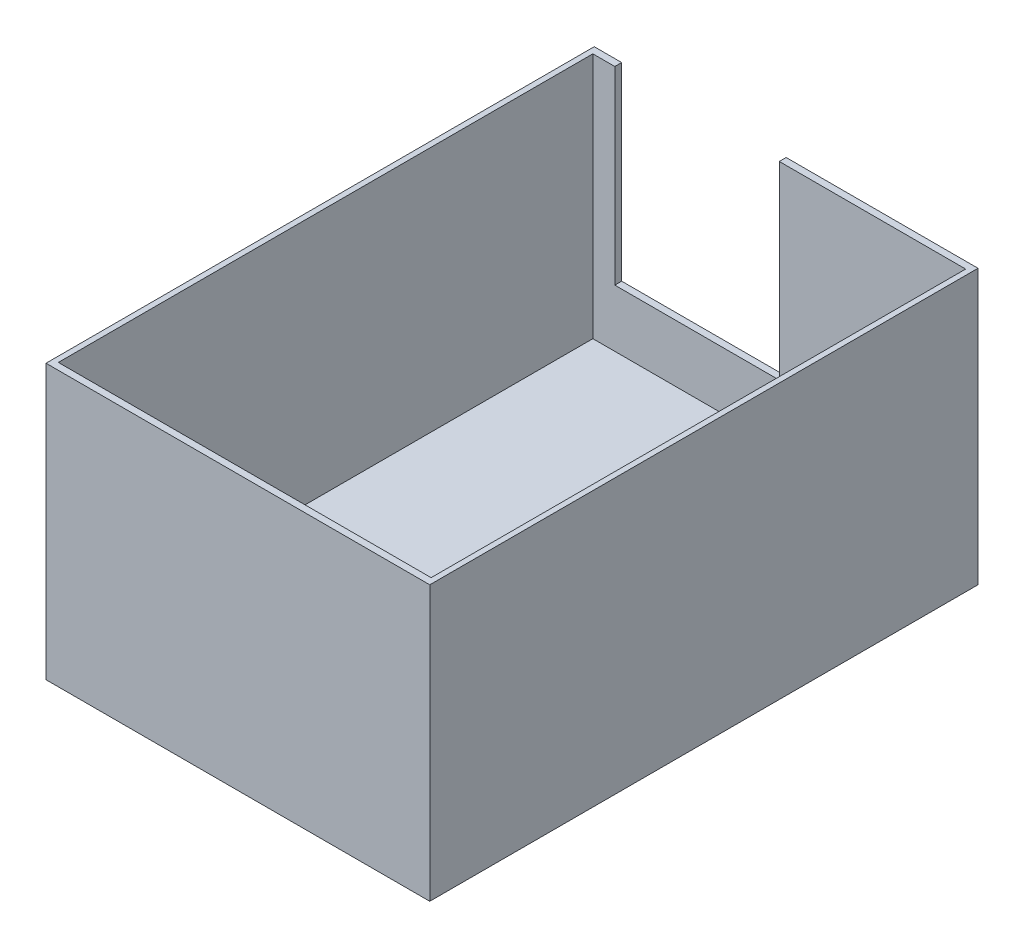
ISO-10303-21;
HEADER;
FILE_DESCRIPTION(('STEP AP214'),'2;1');
FILE_NAME('part.step','',(''),(''),'','','');
FILE_SCHEMA(('AUTOMOTIVE_DESIGN { 1 0 10303 214 1 1 1 1 }'));
ENDSEC;
DATA;
#1=APPLICATION_CONTEXT('core data for automotive mechanical design processes');
#2=APPLICATION_PROTOCOL_DEFINITION('international standard','automotive_design',2000,#1);
#3=PRODUCT_CONTEXT('',#1,'mechanical');
#4=PRODUCT('Part','Part','',(#3));
#5=PRODUCT_RELATED_PRODUCT_CATEGORY('part','',(#4));
#6=PRODUCT_DEFINITION_FORMATION('','',#4);
#7=PRODUCT_DEFINITION_CONTEXT('part definition',#1,'design');
#8=PRODUCT_DEFINITION('design','',#6,#7);
#9=PRODUCT_DEFINITION_SHAPE('','',#8);
#10=(LENGTH_UNIT() NAMED_UNIT(*) SI_UNIT(.MILLI.,.METRE.));
#11=(NAMED_UNIT(*) PLANE_ANGLE_UNIT() SI_UNIT($,.RADIAN.));
#12=(NAMED_UNIT(*) SI_UNIT($,.STERADIAN.) SOLID_ANGLE_UNIT());
#13=UNCERTAINTY_MEASURE_WITH_UNIT(LENGTH_MEASURE(1.E-05),#10,'distance_accuracy_value','');
#14=(GEOMETRIC_REPRESENTATION_CONTEXT(3) GLOBAL_UNCERTAINTY_ASSIGNED_CONTEXT((#13)) GLOBAL_UNIT_ASSIGNED_CONTEXT((#10,
#11,#12)) REPRESENTATION_CONTEXT('',''));
#15=CARTESIAN_POINT('',(0.,0.,0.));
#16=DIRECTION('',(0.,0.,1.));
#17=DIRECTION('',(1.,0.,0.));
#18=AXIS2_PLACEMENT_3D('',#15,#16,#17);
#19=CARTESIAN_POINT('',(35.,50.,-50.));
#20=DIRECTION('',(-1.,0.,0.));
#21=DIRECTION('',(0.,0.,1.));
#22=AXIS2_PLACEMENT_3D('',#19,#20,#21);
#23=PLANE('',#22);
#24=DIRECTION('',(0.,0.,-1.));
#25=VECTOR('',#24,1.);
#26=CARTESIAN_POINT('',(35.,0.,-50.));
#27=LINE('',#26,#25);
#28=CARTESIAN_POINT('',(35.,0.,50.));
#29=VERTEX_POINT('',#28);
#30=CARTESIAN_POINT('',(35.,0.,-50.));
#31=VERTEX_POINT('',#30);
#32=EDGE_CURVE('E196',#29,#31,#27,.T.);
#33=ORIENTED_EDGE('',*,*,#32,.T.);
#34=DIRECTION('',(0.,-1.,0.));
#35=VECTOR('',#34,1.);
#36=CARTESIAN_POINT('',(35.,50.,-50.));
#37=LINE('',#36,#35);
#38=CARTESIAN_POINT('',(35.,50.,-50.));
#39=VERTEX_POINT('',#38);
#40=EDGE_CURVE('E244',#39,#31,#37,.T.);
#41=ORIENTED_EDGE('',*,*,#40,.F.);
#42=DIRECTION('',(0.,0.,-1.));
#43=VECTOR('',#42,1.);
#44=CARTESIAN_POINT('',(35.,50.,-50.));
#45=LINE('',#44,#43);
#46=CARTESIAN_POINT('',(35.,50.,50.));
#47=VERTEX_POINT('',#46);
#48=EDGE_CURVE('E206',#47,#39,#45,.T.);
#49=ORIENTED_EDGE('',*,*,#48,.F.);
#50=DIRECTION('',(0.,-1.,0.));
#51=VECTOR('',#50,1.);
#52=CARTESIAN_POINT('',(35.,50.,50.));
#53=LINE('',#52,#51);
#54=EDGE_CURVE('E221',#47,#29,#53,.T.);
#55=ORIENTED_EDGE('',*,*,#54,.T.);
#56=EDGE_LOOP('',(#33,#41,#49,#55));
#57=FACE_BOUND('',#56,.T.);
#58=ADVANCED_FACE('F39',(#57),#23,.F.);
#59=CARTESIAN_POINT('',(-35.,50.,-50.));
#60=DIRECTION('',(0.,0.,1.));
#61=DIRECTION('',(1.,0.,0.));
#62=AXIS2_PLACEMENT_3D('',#59,#60,#61);
#63=PLANE('',#62);
#64=DIRECTION('',(-1.,0.,0.));
#65=VECTOR('',#64,1.);
#66=CARTESIAN_POINT('',(0.,15.4616107052777,-50.));
#67=LINE('',#66,#65);
#68=CARTESIAN_POINT('',(0.,15.4616107052777,-50.));
#69=VERTEX_POINT('',#68);
#70=CARTESIAN_POINT('',(-30.,15.4616107052777,-50.));
#71=VERTEX_POINT('',#70);
#72=EDGE_CURVE('E138',#69,#71,#67,.T.);
#73=ORIENTED_EDGE('',*,*,#72,.F.);
#74=DIRECTION('',(0.,-1.,0.));
#75=VECTOR('',#74,1.);
#76=CARTESIAN_POINT('',(0.,15.4616107052777,-50.));
#77=LINE('',#76,#75);
#78=CARTESIAN_POINT('',(0.,50.,-50.));
#79=VERTEX_POINT('',#78);
#80=EDGE_CURVE('E128',#79,#69,#77,.T.);
#81=ORIENTED_EDGE('',*,*,#80,.F.);
#82=DIRECTION('',(-1.,0.,0.));
#83=VECTOR('',#82,1.);
#84=CARTESIAN_POINT('',(-35.,50.,-50.));
#85=LINE('',#84,#83);
#86=EDGE_CURVE('E212',#39,#79,#85,.T.);
#87=ORIENTED_EDGE('',*,*,#86,.F.);
#88=ORIENTED_EDGE('',*,*,#40,.T.);
#89=DIRECTION('',(-1.,0.,0.));
#90=VECTOR('',#89,1.);
#91=CARTESIAN_POINT('',(-35.,0.,-50.));
#92=LINE('',#91,#90);
#93=CARTESIAN_POINT('',(-35.,0.,-50.));
#94=VERTEX_POINT('',#93);
#95=EDGE_CURVE('E225',#31,#94,#92,.T.);
#96=ORIENTED_EDGE('',*,*,#95,.T.);
#97=DIRECTION('',(0.,-1.,0.));
#98=VECTOR('',#97,1.);
#99=CARTESIAN_POINT('',(-35.,50.,-50.));
#100=LINE('',#99,#98);
#101=CARTESIAN_POINT('',(-35.,50.,-50.));
#102=VERTEX_POINT('',#101);
#103=EDGE_CURVE('E240',#102,#94,#100,.T.);
#104=ORIENTED_EDGE('',*,*,#103,.F.);
#105=CARTESIAN_POINT('',(-30.,50.,-50.));
#106=VERTEX_POINT('',#105);
#107=EDGE_CURVE('E210',#106,#102,#85,.T.);
#108=ORIENTED_EDGE('',*,*,#107,.F.);
#109=DIRECTION('',(0.,1.,0.));
#110=VECTOR('',#109,1.);
#111=CARTESIAN_POINT('',(-30.,15.4616107052777,-50.));
#112=LINE('',#111,#110);
#113=EDGE_CURVE('E145',#71,#106,#112,.T.);
#114=ORIENTED_EDGE('',*,*,#113,.F.);
#115=EDGE_LOOP('',(#73,#81,#87,#88,#96,#104,#108,#114));
#116=FACE_BOUND('',#115,.T.);
#117=ADVANCED_FACE('F147',(#116),#63,.F.);
#118=CARTESIAN_POINT('',(-35.,50.,-50.));
#119=DIRECTION('',(1.,0.,0.));
#120=DIRECTION('',(0.,0.,-1.));
#121=AXIS2_PLACEMENT_3D('',#118,#119,#120);
#122=PLANE('',#121);
#123=DIRECTION('',(0.,0.,1.));
#124=VECTOR('',#123,1.);
#125=CARTESIAN_POINT('',(-35.,0.,-50.));
#126=LINE('',#125,#124);
#127=CARTESIAN_POINT('',(-35.,0.,50.));
#128=VERTEX_POINT('',#127);
#129=EDGE_CURVE('E228',#94,#128,#126,.T.);
#130=ORIENTED_EDGE('',*,*,#129,.T.);
#131=DIRECTION('',(0.,-1.,0.));
#132=VECTOR('',#131,1.);
#133=CARTESIAN_POINT('',(-35.,50.,50.));
#134=LINE('',#133,#132);
#135=CARTESIAN_POINT('',(-35.,50.,50.));
#136=VERTEX_POINT('',#135);
#137=EDGE_CURVE('E236',#136,#128,#134,.T.);
#138=ORIENTED_EDGE('',*,*,#137,.F.);
#139=DIRECTION('',(0.,0.,1.));
#140=VECTOR('',#139,1.);
#141=CARTESIAN_POINT('',(-35.,50.,-50.));
#142=LINE('',#141,#140);
#143=EDGE_CURVE('E215',#102,#136,#142,.T.);
#144=ORIENTED_EDGE('',*,*,#143,.F.);
#145=ORIENTED_EDGE('',*,*,#103,.T.);
#146=EDGE_LOOP('',(#130,#138,#144,#145));
#147=FACE_BOUND('',#146,.T.);
#148=ADVANCED_FACE('F267',(#147),#122,.F.);
#149=CARTESIAN_POINT('',(-35.,50.,50.));
#150=DIRECTION('',(0.,0.,-1.));
#151=DIRECTION('',(-1.,0.,0.));
#152=AXIS2_PLACEMENT_3D('',#149,#150,#151);
#153=PLANE('',#152);
#154=DIRECTION('',(1.,0.,0.));
#155=VECTOR('',#154,1.);
#156=CARTESIAN_POINT('',(-35.,0.,50.));
#157=LINE('',#156,#155);
#158=EDGE_CURVE('E211',#128,#29,#157,.T.);
#159=ORIENTED_EDGE('',*,*,#158,.T.);
#160=ORIENTED_EDGE('',*,*,#54,.F.);
#161=DIRECTION('',(1.,0.,0.));
#162=VECTOR('',#161,1.);
#163=CARTESIAN_POINT('',(-35.,50.,50.));
#164=LINE('',#163,#162);
#165=EDGE_CURVE('E218',#136,#47,#164,.T.);
#166=ORIENTED_EDGE('',*,*,#165,.F.);
#167=ORIENTED_EDGE('',*,*,#137,.T.);
#168=EDGE_LOOP('',(#159,#160,#166,#167));
#169=FACE_BOUND('',#168,.T.);
#170=ADVANCED_FACE('F272',(#169),#153,.F.);
#171=CARTESIAN_POINT('',(0.,50.,0.));
#172=DIRECTION('',(0.,1.,0.));
#173=DIRECTION('',(0.,0.,1.));
#174=AXIS2_PLACEMENT_3D('',#171,#172,#173);
#175=PLANE('',#174);
#176=DIRECTION('',(0.,0.,-1.));
#177=VECTOR('',#176,1.);
#178=CARTESIAN_POINT('',(0.,50.,0.));
#179=LINE('',#178,#177);
#180=CARTESIAN_POINT('',(0.,50.,-48.75));
#181=VERTEX_POINT('',#180);
#182=EDGE_CURVE('E133',#181,#79,#179,.T.);
#183=ORIENTED_EDGE('',*,*,#182,.F.);
#184=DIRECTION('',(-1.,0.,0.));
#185=VECTOR('',#184,1.);
#186=CARTESIAN_POINT('',(-34.,50.,-48.75));
#187=LINE('',#186,#185);
#188=CARTESIAN_POINT('',(34.,50.,-48.75));
#189=VERTEX_POINT('',#188);
#190=EDGE_CURVE('E182',#189,#181,#187,.T.);
#191=ORIENTED_EDGE('',*,*,#190,.F.);
#192=DIRECTION('',(0.,0.,-1.));
#193=VECTOR('',#192,1.);
#194=CARTESIAN_POINT('',(34.,50.,-48.75));
#195=LINE('',#194,#193);
#196=CARTESIAN_POINT('',(34.,50.,48.75));
#197=VERTEX_POINT('',#196);
#198=EDGE_CURVE('E62',#197,#189,#195,.T.);
#199=ORIENTED_EDGE('',*,*,#198,.F.);
#200=DIRECTION('',(1.,0.,0.));
#201=VECTOR('',#200,1.);
#202=CARTESIAN_POINT('',(-34.,50.,48.75));
#203=LINE('',#202,#201);
#204=CARTESIAN_POINT('',(-34.,50.,48.75));
#205=VERTEX_POINT('',#204);
#206=EDGE_CURVE('E166',#205,#197,#203,.T.);
#207=ORIENTED_EDGE('',*,*,#206,.F.);
#208=DIRECTION('',(0.,0.,1.));
#209=VECTOR('',#208,1.);
#210=CARTESIAN_POINT('',(-34.,50.,-48.75));
#211=LINE('',#210,#209);
#212=CARTESIAN_POINT('',(-34.,50.,-48.75));
#213=VERTEX_POINT('',#212);
#214=EDGE_CURVE('E186',#213,#205,#211,.T.);
#215=ORIENTED_EDGE('',*,*,#214,.F.);
#216=CARTESIAN_POINT('',(-30.,50.,-48.75));
#217=VERTEX_POINT('',#216);
#218=EDGE_CURVE('E181',#217,#213,#187,.T.);
#219=ORIENTED_EDGE('',*,*,#218,.F.);
#220=DIRECTION('',(0.,0.,1.));
#221=VECTOR('',#220,1.);
#222=CARTESIAN_POINT('',(-30.,50.,0.));
#223=LINE('',#222,#221);
#224=EDGE_CURVE('E155',#106,#217,#223,.T.);
#225=ORIENTED_EDGE('',*,*,#224,.F.);
#226=ORIENTED_EDGE('',*,*,#107,.T.);
#227=ORIENTED_EDGE('',*,*,#143,.T.);
#228=ORIENTED_EDGE('',*,*,#165,.T.);
#229=ORIENTED_EDGE('',*,*,#48,.T.);
#230=ORIENTED_EDGE('',*,*,#86,.T.);
#231=EDGE_LOOP('',(#183,#191,#199,#207,#215,#219,#225,#226,#227,#228,#229,#230));
#232=FACE_BOUND('',#231,.T.);
#233=ADVANCED_FACE('F258',(#232),#175,.T.);
#234=CARTESIAN_POINT('',(0.,0.,0.));
#235=DIRECTION('',(0.,1.,0.));
#236=DIRECTION('',(0.,0.,1.));
#237=AXIS2_PLACEMENT_3D('',#234,#235,#236);
#238=PLANE('',#237);
#239=ORIENTED_EDGE('',*,*,#32,.F.);
#240=ORIENTED_EDGE('',*,*,#158,.F.);
#241=ORIENTED_EDGE('',*,*,#129,.F.);
#242=ORIENTED_EDGE('',*,*,#95,.F.);
#243=EDGE_LOOP('',(#239,#240,#241,#242));
#244=FACE_BOUND('',#243,.T.);
#245=ADVANCED_FACE('F278',(#244),#238,.F.);
#246=CARTESIAN_POINT('',(34.,5.,-48.75));
#247=DIRECTION('',(1.,0.,0.));
#248=DIRECTION('',(0.,0.,-1.));
#249=AXIS2_PLACEMENT_3D('',#246,#247,#248);
#250=PLANE('',#249);
#251=ORIENTED_EDGE('',*,*,#198,.T.);
#252=DIRECTION('',(0.,1.,0.));
#253=VECTOR('',#252,1.);
#254=CARTESIAN_POINT('',(34.,5.,-48.75));
#255=LINE('',#254,#253);
#256=CARTESIAN_POINT('',(34.,5.,-48.75));
#257=VERTEX_POINT('',#256);
#258=EDGE_CURVE('E178',#257,#189,#255,.T.);
#259=ORIENTED_EDGE('',*,*,#258,.F.);
#260=DIRECTION('',(0.,0.,-1.));
#261=VECTOR('',#260,1.);
#262=CARTESIAN_POINT('',(34.,5.,-48.75));
#263=LINE('',#262,#261);
#264=CARTESIAN_POINT('',(34.,5.,48.75));
#265=VERTEX_POINT('',#264);
#266=EDGE_CURVE('E161',#265,#257,#263,.T.);
#267=ORIENTED_EDGE('',*,*,#266,.F.);
#268=DIRECTION('',(0.,1.,0.));
#269=VECTOR('',#268,1.);
#270=CARTESIAN_POINT('',(34.,5.,48.75));
#271=LINE('',#270,#269);
#272=EDGE_CURVE('E193',#265,#197,#271,.T.);
#273=ORIENTED_EDGE('',*,*,#272,.T.);
#274=EDGE_LOOP('',(#251,#259,#267,#273));
#275=FACE_BOUND('',#274,.T.);
#276=ADVANCED_FACE('F280',(#275),#250,.F.);
#277=CARTESIAN_POINT('',(-34.,5.,48.75));
#278=DIRECTION('',(0.,0.,1.));
#279=DIRECTION('',(1.,0.,0.));
#280=AXIS2_PLACEMENT_3D('',#277,#278,#279);
#281=PLANE('',#280);
#282=ORIENTED_EDGE('',*,*,#206,.T.);
#283=ORIENTED_EDGE('',*,*,#272,.F.);
#284=DIRECTION('',(1.,0.,0.));
#285=VECTOR('',#284,1.);
#286=CARTESIAN_POINT('',(-34.,5.,48.75));
#287=LINE('',#286,#285);
#288=CARTESIAN_POINT('',(-34.,5.,48.75));
#289=VERTEX_POINT('',#288);
#290=EDGE_CURVE('E174',#289,#265,#287,.T.);
#291=ORIENTED_EDGE('',*,*,#290,.F.);
#292=DIRECTION('',(0.,1.,0.));
#293=VECTOR('',#292,1.);
#294=CARTESIAN_POINT('',(-34.,5.,48.75));
#295=LINE('',#294,#293);
#296=EDGE_CURVE('E197',#289,#205,#295,.T.);
#297=ORIENTED_EDGE('',*,*,#296,.T.);
#298=EDGE_LOOP('',(#282,#283,#291,#297));
#299=FACE_BOUND('',#298,.T.);
#300=ADVANCED_FACE('F286',(#299),#281,.F.);
#301=CARTESIAN_POINT('',(-34.,5.,-48.75));
#302=DIRECTION('',(-1.,0.,0.));
#303=DIRECTION('',(0.,0.,1.));
#304=AXIS2_PLACEMENT_3D('',#301,#302,#303);
#305=PLANE('',#304);
#306=ORIENTED_EDGE('',*,*,#214,.T.);
#307=ORIENTED_EDGE('',*,*,#296,.F.);
#308=DIRECTION('',(0.,0.,1.));
#309=VECTOR('',#308,1.);
#310=CARTESIAN_POINT('',(-34.,5.,-48.75));
#311=LINE('',#310,#309);
#312=CARTESIAN_POINT('',(-34.,5.,-48.75));
#313=VERTEX_POINT('',#312);
#314=EDGE_CURVE('E170',#313,#289,#311,.T.);
#315=ORIENTED_EDGE('',*,*,#314,.F.);
#316=DIRECTION('',(0.,1.,0.));
#317=VECTOR('',#316,1.);
#318=CARTESIAN_POINT('',(-34.,5.,-48.75));
#319=LINE('',#318,#317);
#320=EDGE_CURVE('E200',#313,#213,#319,.T.);
#321=ORIENTED_EDGE('',*,*,#320,.T.);
#322=EDGE_LOOP('',(#306,#307,#315,#321));
#323=FACE_BOUND('',#322,.T.);
#324=ADVANCED_FACE('F321',(#323),#305,.F.);
#325=CARTESIAN_POINT('',(-34.,5.,-48.75));
#326=DIRECTION('',(0.,0.,-1.));
#327=DIRECTION('',(-1.,0.,0.));
#328=AXIS2_PLACEMENT_3D('',#325,#326,#327);
#329=PLANE('',#328);
#330=ORIENTED_EDGE('',*,*,#190,.T.);
#331=DIRECTION('',(0.,-1.,0.));
#332=VECTOR('',#331,1.);
#333=CARTESIAN_POINT('',(0.,5.,-48.75));
#334=LINE('',#333,#332);
#335=CARTESIAN_POINT('',(0.,15.4616107052777,-48.75));
#336=VERTEX_POINT('',#335);
#337=EDGE_CURVE('E11',#181,#336,#334,.T.);
#338=ORIENTED_EDGE('',*,*,#337,.T.);
#339=DIRECTION('',(-1.,0.,0.));
#340=VECTOR('',#339,1.);
#341=CARTESIAN_POINT('',(-34.,15.4616107052777,-48.75));
#342=LINE('',#341,#340);
#343=CARTESIAN_POINT('',(-30.,15.4616107052777,-48.75));
#344=VERTEX_POINT('',#343);
#345=EDGE_CURVE('E143',#336,#344,#342,.T.);
#346=ORIENTED_EDGE('',*,*,#345,.T.);
#347=DIRECTION('',(0.,1.,0.));
#348=VECTOR('',#347,1.);
#349=CARTESIAN_POINT('',(-30.,5.,-48.75));
#350=LINE('',#349,#348);
#351=EDGE_CURVE('E47',#344,#217,#350,.T.);
#352=ORIENTED_EDGE('',*,*,#351,.T.);
#353=ORIENTED_EDGE('',*,*,#218,.T.);
#354=ORIENTED_EDGE('',*,*,#320,.F.);
#355=DIRECTION('',(-1.,0.,0.));
#356=VECTOR('',#355,1.);
#357=CARTESIAN_POINT('',(-34.,5.,-48.75));
#358=LINE('',#357,#356);
#359=EDGE_CURVE('E165',#257,#313,#358,.T.);
#360=ORIENTED_EDGE('',*,*,#359,.F.);
#361=ORIENTED_EDGE('',*,*,#258,.T.);
#362=EDGE_LOOP('',(#330,#338,#346,#352,#353,#354,#360,#361));
#363=FACE_BOUND('',#362,.T.);
#364=ADVANCED_FACE('F253',(#363),#329,.F.);
#365=CARTESIAN_POINT('',(0.,5.,0.));
#366=DIRECTION('',(0.,1.,0.));
#367=DIRECTION('',(0.,0.,1.));
#368=AXIS2_PLACEMENT_3D('',#365,#366,#367);
#369=PLANE('',#368);
#370=ORIENTED_EDGE('',*,*,#266,.T.);
#371=ORIENTED_EDGE('',*,*,#359,.T.);
#372=ORIENTED_EDGE('',*,*,#314,.T.);
#373=ORIENTED_EDGE('',*,*,#290,.T.);
#374=EDGE_LOOP('',(#370,#371,#372,#373));
#375=FACE_BOUND('',#374,.T.);
#376=ADVANCED_FACE('F320',(#375),#369,.T.);
#377=CARTESIAN_POINT('',(0.,15.4616107052777,-44.5));
#378=DIRECTION('',(0.,-1.,0.));
#379=DIRECTION('',(0.,0.,-1.));
#380=AXIS2_PLACEMENT_3D('',#377,#378,#379);
#381=PLANE('',#380);
#382=DIRECTION('',(0.,0.,-1.));
#383=VECTOR('',#382,1.);
#384=CARTESIAN_POINT('',(0.,15.4616107052777,-44.5));
#385=LINE('',#384,#383);
#386=EDGE_CURVE('E131',#336,#69,#385,.T.);
#387=ORIENTED_EDGE('',*,*,#386,.T.);
#388=ORIENTED_EDGE('',*,*,#72,.T.);
#389=DIRECTION('',(0.,0.,-1.));
#390=VECTOR('',#389,1.);
#391=CARTESIAN_POINT('',(-30.,15.4616107052777,-44.5));
#392=LINE('',#391,#390);
#393=EDGE_CURVE('E54',#344,#71,#392,.T.);
#394=ORIENTED_EDGE('',*,*,#393,.F.);
#395=ORIENTED_EDGE('',*,*,#345,.F.);
#396=EDGE_LOOP('',(#387,#388,#394,#395));
#397=FACE_BOUND('',#396,.T.);
#398=ADVANCED_FACE('F140',(#397),#381,.F.);
#399=CARTESIAN_POINT('',(0.,15.4616107052777,-44.5));
#400=DIRECTION('',(1.,0.,0.));
#401=DIRECTION('',(0.,0.,-1.));
#402=AXIS2_PLACEMENT_3D('',#399,#400,#401);
#403=PLANE('',#402);
#404=ORIENTED_EDGE('',*,*,#182,.T.);
#405=ORIENTED_EDGE('',*,*,#80,.T.);
#406=ORIENTED_EDGE('',*,*,#386,.F.);
#407=ORIENTED_EDGE('',*,*,#337,.F.);
#408=EDGE_LOOP('',(#404,#405,#406,#407));
#409=FACE_BOUND('',#408,.T.);
#410=ADVANCED_FACE('F130',(#409),#403,.F.);
#411=CARTESIAN_POINT('',(-30.,15.4616107052777,-44.5));
#412=DIRECTION('',(-1.,0.,0.));
#413=DIRECTION('',(0.,0.,1.));
#414=AXIS2_PLACEMENT_3D('',#411,#412,#413);
#415=PLANE('',#414);
#416=ORIENTED_EDGE('',*,*,#224,.T.);
#417=ORIENTED_EDGE('',*,*,#351,.F.);
#418=ORIENTED_EDGE('',*,*,#393,.T.);
#419=ORIENTED_EDGE('',*,*,#113,.T.);
#420=EDGE_LOOP('',(#416,#417,#418,#419));
#421=FACE_BOUND('',#420,.T.);
#422=ADVANCED_FACE('F342',(#421),#415,.F.);
#423=CLOSED_SHELL('',(#58,#117,#148,#170,#233,#245,#276,#300,#324,#364,#376,#398,#410,#422));
#424=MANIFOLD_SOLID_BREP('B2',#423);
#425=ADVANCED_BREP_SHAPE_REPRESENTATION('',(#18,#424),#14);
#426=SHAPE_DEFINITION_REPRESENTATION(#9,#425);
ENDSEC;
END-ISO-10303-21;
